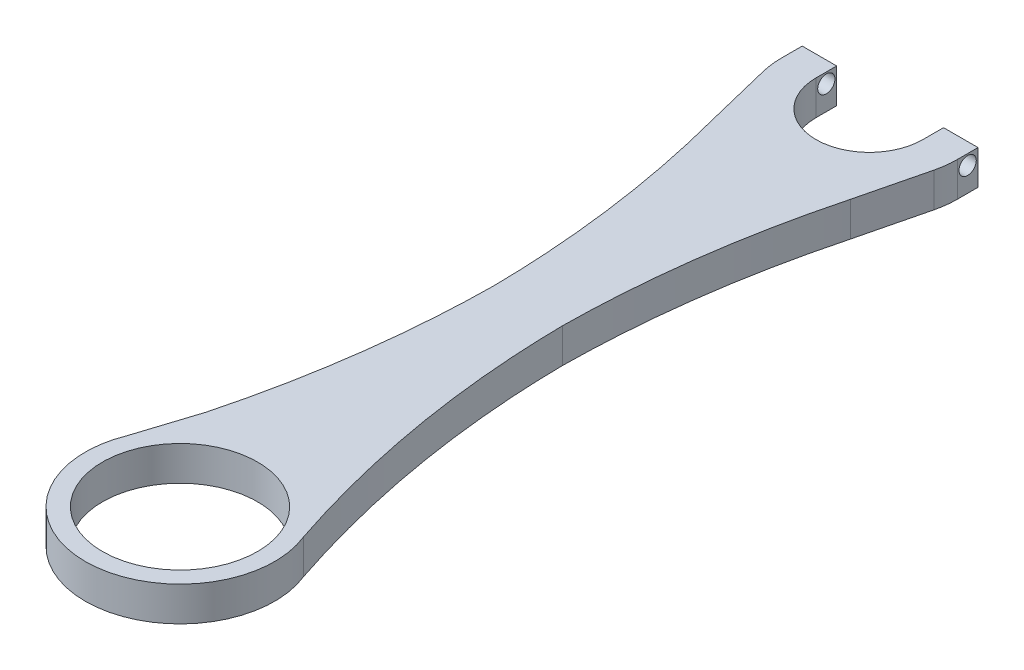
ISO-10303-21;
HEADER;
FILE_DESCRIPTION(('STEP AP214'),'2;1');
FILE_NAME('part.step','',(''),(''),'','','');
FILE_SCHEMA(('AUTOMOTIVE_DESIGN { 1 0 10303 214 1 1 1 1 }'));
ENDSEC;
DATA;
#1=APPLICATION_CONTEXT('core data for automotive mechanical design processes');
#2=APPLICATION_PROTOCOL_DEFINITION('international standard','automotive_design',2000,#1);
#3=PRODUCT_CONTEXT('',#1,'mechanical');
#4=PRODUCT('Part','Part','',(#3));
#5=PRODUCT_RELATED_PRODUCT_CATEGORY('part','',(#4));
#6=PRODUCT_DEFINITION_FORMATION('','',#4);
#7=PRODUCT_DEFINITION_CONTEXT('part definition',#1,'design');
#8=PRODUCT_DEFINITION('design','',#6,#7);
#9=PRODUCT_DEFINITION_SHAPE('','',#8);
#10=(LENGTH_UNIT() NAMED_UNIT(*) SI_UNIT(.MILLI.,.METRE.));
#11=(NAMED_UNIT(*) PLANE_ANGLE_UNIT() SI_UNIT($,.RADIAN.));
#12=(NAMED_UNIT(*) SI_UNIT($,.STERADIAN.) SOLID_ANGLE_UNIT());
#13=UNCERTAINTY_MEASURE_WITH_UNIT(LENGTH_MEASURE(1.E-05),#10,'distance_accuracy_value','');
#14=(GEOMETRIC_REPRESENTATION_CONTEXT(3) GLOBAL_UNCERTAINTY_ASSIGNED_CONTEXT((#13)) GLOBAL_UNIT_ASSIGNED_CONTEXT((#10,
#11,#12)) REPRESENTATION_CONTEXT('',''));
#15=CARTESIAN_POINT('',(0.,0.,0.));
#16=DIRECTION('',(0.,0.,1.));
#17=DIRECTION('',(1.,0.,0.));
#18=AXIS2_PLACEMENT_3D('',#15,#16,#17);
#19=CARTESIAN_POINT('',(24.7655320161866,10.,6.07605332063795));
#20=DIRECTION('',(-0.971197333968103,0.,-0.238276600809331));
#21=DIRECTION('',(-0.238276600809331,0.,0.971197333968103));
#22=AXIS2_PLACEMENT_3D('',#19,#20,#21);
#23=PLANE('',#22);
#24=DIRECTION('',(0.238276600809331,0.,-0.971197333968103));
#25=VECTOR('',#24,1.);
#26=CARTESIAN_POINT('',(24.7655320161866,0.,6.07605332063795));
#27=LINE('',#26,#25);
#28=CARTESIAN_POINT('',(20.,0.,25.5));
#29=VERTEX_POINT('',#28);
#30=CARTESIAN_POINT('',(24.7655320161866,0.,6.07605332063795));
#31=VERTEX_POINT('',#30);
#32=EDGE_CURVE('E311',#29,#31,#27,.T.);
#33=ORIENTED_EDGE('',*,*,#32,.T.);
#34=DIRECTION('',(0.,-1.,0.));
#35=VECTOR('',#34,1.);
#36=CARTESIAN_POINT('',(24.7655320161866,10.,6.07605332063795));
#37=LINE('',#36,#35);
#38=CARTESIAN_POINT('',(24.7655320161866,10.,6.07605332063795));
#39=VERTEX_POINT('',#38);
#40=EDGE_CURVE('E12',#39,#31,#37,.T.);
#41=ORIENTED_EDGE('',*,*,#40,.F.);
#42=DIRECTION('',(0.238276600809331,0.,-0.971197333968103));
#43=VECTOR('',#42,1.);
#44=CARTESIAN_POINT('',(24.7655320161866,10.,6.07605332063795));
#45=LINE('',#44,#43);
#46=CARTESIAN_POINT('',(20.,10.,25.5));
#47=VERTEX_POINT('',#46);
#48=EDGE_CURVE('E354',#47,#39,#45,.T.);
#49=ORIENTED_EDGE('',*,*,#48,.F.);
#50=DIRECTION('',(0.,-1.,0.));
#51=VECTOR('',#50,1.);
#52=CARTESIAN_POINT('',(20.,10.,25.5));
#53=LINE('',#52,#51);
#54=EDGE_CURVE('E132',#47,#29,#53,.T.);
#55=ORIENTED_EDGE('',*,*,#54,.T.);
#56=EDGE_LOOP('',(#33,#41,#49,#55));
#57=FACE_BOUND('',#56,.T.);
#58=ADVANCED_FACE('F116',(#57),#23,.F.);
#59=CARTESIAN_POINT('',(0.,10.,0.));
#60=DIRECTION('',(0.,-1.,0.));
#61=DIRECTION('',(0.,0.,-1.));
#62=AXIS2_PLACEMENT_3D('',#59,#60,#61);
#63=CYLINDRICAL_SURFACE('',#62,25.5);
#64=CARTESIAN_POINT('',(0.,0.,0.));
#65=DIRECTION('',(0.,1.,0.));
#66=DIRECTION('',(0.,0.,1.));
#67=AXIS2_PLACEMENT_3D('',#64,#65,#66);
#68=CIRCLE('',#67,25.5);
#69=CARTESIAN_POINT('',(25.5,0.,0.));
#70=VERTEX_POINT('',#69);
#71=EDGE_CURVE('E314',#31,#70,#68,.T.);
#72=ORIENTED_EDGE('',*,*,#71,.T.);
#73=DIRECTION('',(0.,-1.,0.));
#74=VECTOR('',#73,1.);
#75=CARTESIAN_POINT('',(25.5,10.,0.));
#76=LINE('',#75,#74);
#77=CARTESIAN_POINT('',(25.5,10.,0.));
#78=VERTEX_POINT('',#77);
#79=EDGE_CURVE('E124',#78,#70,#76,.T.);
#80=ORIENTED_EDGE('',*,*,#79,.F.);
#81=CARTESIAN_POINT('',(0.,10.,0.));
#82=DIRECTION('',(0.,1.,0.));
#83=DIRECTION('',(0.,0.,1.));
#84=AXIS2_PLACEMENT_3D('',#81,#82,#83);
#85=CIRCLE('',#84,25.5);
#86=EDGE_CURVE('E189',#39,#78,#85,.T.);
#87=ORIENTED_EDGE('',*,*,#86,.F.);
#88=ORIENTED_EDGE('',*,*,#40,.T.);
#89=EDGE_LOOP('',(#72,#80,#87,#88));
#90=FACE_BOUND('',#89,.T.);
#91=ADVANCED_FACE('F276',(#90),#63,.T.);
#92=CARTESIAN_POINT('',(25.5,10.,0.));
#93=DIRECTION('',(-1.,0.,0.));
#94=DIRECTION('',(0.,0.,1.));
#95=AXIS2_PLACEMENT_3D('',#92,#93,#94);
#96=PLANE('',#95);
#97=CARTESIAN_POINT('',(25.5,7.,-3.));
#98=DIRECTION('',(-1.,0.,0.));
#99=DIRECTION('',(0.,0.,1.));
#100=AXIS2_PLACEMENT_3D('',#97,#98,#99);
#101=CIRCLE('',#100,2.5);
#102=CARTESIAN_POINT('',(25.5,7.,-0.499999999999999));
#103=VERTEX_POINT('',#102);
#104=EDGE_CURVE('E413',#103,#103,#101,.T.);
#105=ORIENTED_EDGE('',*,*,#104,.T.);
#106=EDGE_LOOP('',(#105));
#107=FACE_BOUND('',#106,.T.);
#108=DIRECTION('',(0.,0.,-1.));
#109=VECTOR('',#108,1.);
#110=CARTESIAN_POINT('',(25.5,0.,0.));
#111=LINE('',#110,#109);
#112=CARTESIAN_POINT('',(25.5,0.,-6.));
#113=VERTEX_POINT('',#112);
#114=EDGE_CURVE('E316',#70,#113,#111,.T.);
#115=ORIENTED_EDGE('',*,*,#114,.T.);
#116=DIRECTION('',(0.,-1.,0.));
#117=VECTOR('',#116,1.);
#118=CARTESIAN_POINT('',(25.5,10.,-6.));
#119=LINE('',#118,#117);
#120=CARTESIAN_POINT('',(25.5,10.,-6.));
#121=VERTEX_POINT('',#120);
#122=EDGE_CURVE('E373',#121,#113,#119,.T.);
#123=ORIENTED_EDGE('',*,*,#122,.F.);
#124=DIRECTION('',(0.,0.,-1.));
#125=VECTOR('',#124,1.);
#126=CARTESIAN_POINT('',(25.5,10.,0.));
#127=LINE('',#126,#125);
#128=EDGE_CURVE('E378',#78,#121,#127,.T.);
#129=ORIENTED_EDGE('',*,*,#128,.F.);
#130=ORIENTED_EDGE('',*,*,#79,.T.);
#131=EDGE_LOOP('',(#115,#123,#129,#130));
#132=FACE_BOUND('',#131,.T.);
#133=ADVANCED_FACE('F298',(#107,#132),#96,.F.);
#134=CARTESIAN_POINT('',(0.,10.,-6.));
#135=DIRECTION('',(0.,0.,-1.));
#136=DIRECTION('',(-1.,0.,0.));
#137=AXIS2_PLACEMENT_3D('',#134,#135,#136);
#138=PLANE('',#137);
#139=DIRECTION('',(1.,0.,0.));
#140=VECTOR('',#139,1.);
#141=CARTESIAN_POINT('',(0.,0.,-6.));
#142=LINE('',#141,#140);
#143=CARTESIAN_POINT('',(15.5,0.,-6.));
#144=VERTEX_POINT('',#143);
#145=EDGE_CURVE('E324',#144,#113,#142,.T.);
#146=ORIENTED_EDGE('',*,*,#145,.F.);
#147=DIRECTION('',(0.,-1.,0.));
#148=VECTOR('',#147,1.);
#149=CARTESIAN_POINT('',(15.5,10.,-6.));
#150=LINE('',#149,#148);
#151=CARTESIAN_POINT('',(15.5,10.,-6.));
#152=VERTEX_POINT('',#151);
#153=EDGE_CURVE('E371',#152,#144,#150,.T.);
#154=ORIENTED_EDGE('',*,*,#153,.F.);
#155=DIRECTION('',(1.,0.,0.));
#156=VECTOR('',#155,1.);
#157=CARTESIAN_POINT('',(0.,10.,-6.));
#158=LINE('',#157,#156);
#159=EDGE_CURVE('E386',#152,#121,#158,.T.);
#160=ORIENTED_EDGE('',*,*,#159,.T.);
#161=ORIENTED_EDGE('',*,*,#122,.T.);
#162=EDGE_LOOP('',(#146,#154,#160,#161));
#163=FACE_BOUND('',#162,.T.);
#164=ADVANCED_FACE('F295',(#163),#138,.T.);
#165=CARTESIAN_POINT('',(15.5,10.,0.));
#166=DIRECTION('',(-1.,0.,0.));
#167=DIRECTION('',(0.,0.,1.));
#168=AXIS2_PLACEMENT_3D('',#165,#166,#167);
#169=PLANE('',#168);
#170=CARTESIAN_POINT('',(15.5,7.,-3.));
#171=DIRECTION('',(-1.,0.,0.));
#172=DIRECTION('',(0.,0.,1.));
#173=AXIS2_PLACEMENT_3D('',#170,#171,#172);
#174=CIRCLE('',#173,2.5);
#175=CARTESIAN_POINT('',(15.5,7.,-0.499999999999999));
#176=VERTEX_POINT('',#175);
#177=EDGE_CURVE('E417',#176,#176,#174,.T.);
#178=ORIENTED_EDGE('',*,*,#177,.F.);
#179=EDGE_LOOP('',(#178));
#180=FACE_BOUND('',#179,.T.);
#181=DIRECTION('',(0.,0.,-1.));
#182=VECTOR('',#181,1.);
#183=CARTESIAN_POINT('',(15.5,0.,0.));
#184=LINE('',#183,#182);
#185=CARTESIAN_POINT('',(15.5,0.,0.));
#186=VERTEX_POINT('',#185);
#187=EDGE_CURVE('E327',#186,#144,#184,.T.);
#188=ORIENTED_EDGE('',*,*,#187,.F.);
#189=DIRECTION('',(0.,-1.,0.));
#190=VECTOR('',#189,1.);
#191=CARTESIAN_POINT('',(15.5,10.,0.));
#192=LINE('',#191,#190);
#193=CARTESIAN_POINT('',(15.5,10.,0.));
#194=VERTEX_POINT('',#193);
#195=EDGE_CURVE('E369',#194,#186,#192,.T.);
#196=ORIENTED_EDGE('',*,*,#195,.F.);
#197=DIRECTION('',(0.,0.,-1.));
#198=VECTOR('',#197,1.);
#199=CARTESIAN_POINT('',(15.5,10.,0.));
#200=LINE('',#199,#198);
#201=EDGE_CURVE('E389',#194,#152,#200,.T.);
#202=ORIENTED_EDGE('',*,*,#201,.T.);
#203=ORIENTED_EDGE('',*,*,#153,.T.);
#204=EDGE_LOOP('',(#188,#196,#202,#203));
#205=FACE_BOUND('',#204,.T.);
#206=ADVANCED_FACE('F291',(#180,#205),#169,.T.);
#207=CARTESIAN_POINT('',(0.,10.,0.));
#208=DIRECTION('',(0.,-1.,0.));
#209=DIRECTION('',(0.,0.,-1.));
#210=AXIS2_PLACEMENT_3D('',#207,#208,#209);
#211=CYLINDRICAL_SURFACE('',#210,15.5);
#212=CARTESIAN_POINT('',(0.,0.,0.));
#213=DIRECTION('',(0.,1.,0.));
#214=DIRECTION('',(0.,0.,1.));
#215=AXIS2_PLACEMENT_3D('',#212,#213,#214);
#216=CIRCLE('',#215,15.5);
#217=CARTESIAN_POINT('',(-15.5,0.,0.));
#218=VERTEX_POINT('',#217);
#219=EDGE_CURVE('E330',#218,#186,#216,.T.);
#220=ORIENTED_EDGE('',*,*,#219,.F.);
#221=DIRECTION('',(0.,-1.,0.));
#222=VECTOR('',#221,1.);
#223=CARTESIAN_POINT('',(-15.5,10.,0.));
#224=LINE('',#223,#222);
#225=CARTESIAN_POINT('',(-15.5,10.,0.));
#226=VERTEX_POINT('',#225);
#227=EDGE_CURVE('E367',#226,#218,#224,.T.);
#228=ORIENTED_EDGE('',*,*,#227,.F.);
#229=CARTESIAN_POINT('',(0.,10.,0.));
#230=DIRECTION('',(0.,1.,0.));
#231=DIRECTION('',(0.,0.,1.));
#232=AXIS2_PLACEMENT_3D('',#229,#230,#231);
#233=CIRCLE('',#232,15.5);
#234=EDGE_CURVE('E391',#226,#194,#233,.T.);
#235=ORIENTED_EDGE('',*,*,#234,.T.);
#236=ORIENTED_EDGE('',*,*,#195,.T.);
#237=EDGE_LOOP('',(#220,#228,#235,#236));
#238=FACE_BOUND('',#237,.T.);
#239=ADVANCED_FACE('F287',(#238),#211,.F.);
#240=CARTESIAN_POINT('',(-15.5,10.,0.));
#241=DIRECTION('',(-1.,0.,0.));
#242=DIRECTION('',(0.,0.,1.));
#243=AXIS2_PLACEMENT_3D('',#240,#241,#242);
#244=PLANE('',#243);
#245=CARTESIAN_POINT('',(-15.5,7.,-3.));
#246=DIRECTION('',(-1.,0.,0.));
#247=DIRECTION('',(0.,0.,1.));
#248=AXIS2_PLACEMENT_3D('',#245,#246,#247);
#249=CIRCLE('',#248,2.5);
#250=CARTESIAN_POINT('',(-15.5,7.,-0.499999999999999));
#251=VERTEX_POINT('',#250);
#252=EDGE_CURVE('E738',#251,#251,#249,.T.);
#253=ORIENTED_EDGE('',*,*,#252,.T.);
#254=EDGE_LOOP('',(#253));
#255=FACE_BOUND('',#254,.T.);
#256=DIRECTION('',(0.,0.,-1.));
#257=VECTOR('',#256,1.);
#258=CARTESIAN_POINT('',(-15.5,0.,0.));
#259=LINE('',#258,#257);
#260=CARTESIAN_POINT('',(-15.5,0.,-6.));
#261=VERTEX_POINT('',#260);
#262=EDGE_CURVE('E333',#218,#261,#259,.T.);
#263=ORIENTED_EDGE('',*,*,#262,.T.);
#264=DIRECTION('',(0.,-1.,0.));
#265=VECTOR('',#264,1.);
#266=CARTESIAN_POINT('',(-15.5,10.,-6.));
#267=LINE('',#266,#265);
#268=CARTESIAN_POINT('',(-15.5,10.,-6.));
#269=VERTEX_POINT('',#268);
#270=EDGE_CURVE('E365',#269,#261,#267,.T.);
#271=ORIENTED_EDGE('',*,*,#270,.F.);
#272=DIRECTION('',(0.,0.,-1.));
#273=VECTOR('',#272,1.);
#274=CARTESIAN_POINT('',(-15.5,10.,0.));
#275=LINE('',#274,#273);
#276=EDGE_CURVE('E397',#226,#269,#275,.T.);
#277=ORIENTED_EDGE('',*,*,#276,.F.);
#278=ORIENTED_EDGE('',*,*,#227,.T.);
#279=EDGE_LOOP('',(#263,#271,#277,#278));
#280=FACE_BOUND('',#279,.T.);
#281=ADVANCED_FACE('F283',(#255,#280),#244,.F.);
#282=CARTESIAN_POINT('',(0.,10.,-6.));
#283=DIRECTION('',(0.,0.,-1.));
#284=DIRECTION('',(-1.,0.,0.));
#285=AXIS2_PLACEMENT_3D('',#282,#283,#284);
#286=PLANE('',#285);
#287=DIRECTION('',(1.,0.,0.));
#288=VECTOR('',#287,1.);
#289=CARTESIAN_POINT('',(0.,0.,-6.));
#290=LINE('',#289,#288);
#291=CARTESIAN_POINT('',(-25.5,0.,-6.));
#292=VERTEX_POINT('',#291);
#293=EDGE_CURVE('E336',#292,#261,#290,.T.);
#294=ORIENTED_EDGE('',*,*,#293,.F.);
#295=DIRECTION('',(0.,-1.,0.));
#296=VECTOR('',#295,1.);
#297=CARTESIAN_POINT('',(-25.5,10.,-6.));
#298=LINE('',#297,#296);
#299=CARTESIAN_POINT('',(-25.5,10.,-6.));
#300=VERTEX_POINT('',#299);
#301=EDGE_CURVE('E363',#300,#292,#298,.T.);
#302=ORIENTED_EDGE('',*,*,#301,.F.);
#303=DIRECTION('',(1.,0.,0.));
#304=VECTOR('',#303,1.);
#305=CARTESIAN_POINT('',(0.,10.,-6.));
#306=LINE('',#305,#304);
#307=EDGE_CURVE('E398',#300,#269,#306,.T.);
#308=ORIENTED_EDGE('',*,*,#307,.T.);
#309=ORIENTED_EDGE('',*,*,#270,.T.);
#310=EDGE_LOOP('',(#294,#302,#308,#309));
#311=FACE_BOUND('',#310,.T.);
#312=ADVANCED_FACE('F279',(#311),#286,.T.);
#313=CARTESIAN_POINT('',(-25.5,10.,0.));
#314=DIRECTION('',(-1.,0.,0.));
#315=DIRECTION('',(0.,0.,1.));
#316=AXIS2_PLACEMENT_3D('',#313,#314,#315);
#317=PLANE('',#316);
#318=CARTESIAN_POINT('',(-25.5,7.,-3.));
#319=DIRECTION('',(-1.,0.,0.));
#320=DIRECTION('',(0.,0.,1.));
#321=AXIS2_PLACEMENT_3D('',#318,#319,#320);
#322=CIRCLE('',#321,2.5);
#323=CARTESIAN_POINT('',(-25.5,7.,-0.499999999999999));
#324=VERTEX_POINT('',#323);
#325=EDGE_CURVE('E741',#324,#324,#322,.T.);
#326=ORIENTED_EDGE('',*,*,#325,.F.);
#327=EDGE_LOOP('',(#326));
#328=FACE_BOUND('',#327,.T.);
#329=DIRECTION('',(0.,0.,-1.));
#330=VECTOR('',#329,1.);
#331=CARTESIAN_POINT('',(-25.5,0.,0.));
#332=LINE('',#331,#330);
#333=CARTESIAN_POINT('',(-25.5,0.,0.));
#334=VERTEX_POINT('',#333);
#335=EDGE_CURVE('E339',#334,#292,#332,.T.);
#336=ORIENTED_EDGE('',*,*,#335,.F.);
#337=DIRECTION('',(0.,-1.,0.));
#338=VECTOR('',#337,1.);
#339=CARTESIAN_POINT('',(-25.5,10.,0.));
#340=LINE('',#339,#338);
#341=CARTESIAN_POINT('',(-25.5,10.,0.));
#342=VERTEX_POINT('',#341);
#343=EDGE_CURVE('E242',#342,#334,#340,.T.);
#344=ORIENTED_EDGE('',*,*,#343,.F.);
#345=DIRECTION('',(0.,0.,-1.));
#346=VECTOR('',#345,1.);
#347=CARTESIAN_POINT('',(-25.5,10.,0.));
#348=LINE('',#347,#346);
#349=EDGE_CURVE('E231',#342,#300,#348,.T.);
#350=ORIENTED_EDGE('',*,*,#349,.T.);
#351=ORIENTED_EDGE('',*,*,#301,.T.);
#352=EDGE_LOOP('',(#336,#344,#350,#351));
#353=FACE_BOUND('',#352,.T.);
#354=ADVANCED_FACE('F275',(#328,#353),#317,.T.);
#355=CARTESIAN_POINT('',(-24.7655320161866,0.,6.07605332063793));
#356=VERTEX_POINT('',#355);
#357=EDGE_CURVE('E238',#334,#356,#68,.T.);
#358=ORIENTED_EDGE('',*,*,#357,.T.);
#359=DIRECTION('',(0.,-1.,0.));
#360=VECTOR('',#359,1.);
#361=CARTESIAN_POINT('',(-24.7655320161866,10.,6.07605332063793));
#362=LINE('',#361,#360);
#363=CARTESIAN_POINT('',(-24.7655320161866,10.,6.07605332063793));
#364=VERTEX_POINT('',#363);
#365=EDGE_CURVE('E235',#364,#356,#362,.T.);
#366=ORIENTED_EDGE('',*,*,#365,.F.);
#367=EDGE_CURVE('E221',#342,#364,#85,.T.);
#368=ORIENTED_EDGE('',*,*,#367,.F.);
#369=ORIENTED_EDGE('',*,*,#343,.T.);
#370=EDGE_LOOP('',(#358,#366,#368,#369));
#371=FACE_BOUND('',#370,.T.);
#372=ADVANCED_FACE('F236',(#371),#63,.T.);
#373=CARTESIAN_POINT('',(-24.7655320161866,10.,6.07605332063794));
#374=DIRECTION('',(-0.971197333968103,0.,0.238276600809331));
#375=DIRECTION('',(0.238276600809331,0.,0.971197333968103));
#376=AXIS2_PLACEMENT_3D('',#373,#374,#375);
#377=PLANE('',#376);
#378=DIRECTION('',(-0.238276600809331,0.,-0.971197333968103));
#379=VECTOR('',#378,1.);
#380=CARTESIAN_POINT('',(-24.7655320161866,0.,6.07605332063794));
#381=LINE('',#380,#379);
#382=CARTESIAN_POINT('',(-20.,0.,25.4999999999999));
#383=VERTEX_POINT('',#382);
#384=EDGE_CURVE('E342',#383,#356,#381,.T.);
#385=ORIENTED_EDGE('',*,*,#384,.F.);
#386=DIRECTION('',(0.,-1.,0.));
#387=VECTOR('',#386,1.);
#388=CARTESIAN_POINT('',(-20.,10.,25.4999999999999));
#389=LINE('',#388,#387);
#390=CARTESIAN_POINT('',(-20.,10.,25.4999999999999));
#391=VERTEX_POINT('',#390);
#392=EDGE_CURVE('E243',#391,#383,#389,.T.);
#393=ORIENTED_EDGE('',*,*,#392,.F.);
#394=DIRECTION('',(-0.238276600809331,0.,-0.971197333968103));
#395=VECTOR('',#394,1.);
#396=CARTESIAN_POINT('',(-24.7655320161866,10.,6.07605332063794));
#397=LINE('',#396,#395);
#398=EDGE_CURVE('E228',#391,#364,#397,.T.);
#399=ORIENTED_EDGE('',*,*,#398,.T.);
#400=ORIENTED_EDGE('',*,*,#365,.T.);
#401=EDGE_LOOP('',(#385,#393,#399,#400));
#402=FACE_BOUND('',#401,.T.);
#403=ADVANCED_FACE('F245',(#402),#377,.T.);
#404=CARTESIAN_POINT('',(-20.,10.,25.5));
#405=CARTESIAN_POINT('',(-9.54379787803549,10.,65.2645091880622));
#406=CARTESIAN_POINT('',(-10.,10.,105.767954903258));
#407=B_SPLINE_CURVE_WITH_KNOTS('',2,(#404,#405,#406),.UNSPECIFIED.,.F.,.F.,(3,3),(0.,1.),.UNSPECIFIED.);
#408=DIRECTION('',(0.,-1.,0.));
#409=VECTOR('',#408,1.);
#410=SURFACE_OF_LINEAR_EXTRUSION('',#407,#409);
#411=CARTESIAN_POINT('',(-20.,0.,25.5));
#412=CARTESIAN_POINT('',(-9.54379787803549,0.,65.2645091880622));
#413=CARTESIAN_POINT('',(-10.,0.,105.767954903258));
#414=B_SPLINE_CURVE_WITH_KNOTS('',2,(#411,#412,#413),.UNSPECIFIED.,.F.,.F.,(3,3),(0.,1.),.UNSPECIFIED.);
#415=CARTESIAN_POINT('',(-10.,0.,99.));
#416=VERTEX_POINT('',#415);
#417=EDGE_CURVE('E177',#383,#416,#414,.T.);
#418=ORIENTED_EDGE('',*,*,#417,.T.);
#419=DIRECTION('',(0.,-1.,0.));
#420=VECTOR('',#419,1.);
#421=CARTESIAN_POINT('',(-10.,10.,99.));
#422=LINE('',#421,#420);
#423=CARTESIAN_POINT('',(-10.,10.,99.));
#424=VERTEX_POINT('',#423);
#425=EDGE_CURVE('E359',#424,#416,#422,.T.);
#426=ORIENTED_EDGE('',*,*,#425,.F.);
#427=EDGE_CURVE('E247',#391,#424,#407,.T.);
#428=ORIENTED_EDGE('',*,*,#427,.F.);
#429=ORIENTED_EDGE('',*,*,#392,.T.);
#430=EDGE_LOOP('',(#418,#426,#428,#429));
#431=FACE_BOUND('',#430,.T.);
#432=ADVANCED_FACE('F265',(#431),#410,.F.);
#433=CARTESIAN_POINT('',(20.,10.,25.5));
#434=CARTESIAN_POINT('',(9.54379787803548,10.,65.2645091880622));
#435=CARTESIAN_POINT('',(9.99999999999999,10.,105.767954903258));
#436=B_SPLINE_CURVE_WITH_KNOTS('',2,(#433,#434,#435),.UNSPECIFIED.,.F.,.F.,(3,3),(0.,1.),.UNSPECIFIED.);
#437=DIRECTION('',(0.,-1.,0.));
#438=VECTOR('',#437,1.);
#439=SURFACE_OF_LINEAR_EXTRUSION('',#436,#438);
#440=DIRECTION('',(0.,1.,0.));
#441=VECTOR('',#440,1.);
#442=CARTESIAN_POINT('',(9.99999999999999,0.,99.));
#443=LINE('',#442,#441);
#444=CARTESIAN_POINT('',(9.99999999999999,0.,99.));
#445=VERTEX_POINT('',#444);
#446=CARTESIAN_POINT('',(9.99999999999999,10.,99.));
#447=VERTEX_POINT('',#446);
#448=EDGE_CURVE('E315',#445,#447,#443,.T.);
#449=ORIENTED_EDGE('',*,*,#448,.F.);
#450=CARTESIAN_POINT('',(20.,0.,25.5));
#451=CARTESIAN_POINT('',(9.54379787803548,0.,65.2645091880622));
#452=CARTESIAN_POINT('',(9.99999999999999,0.,105.767954903258));
#453=B_SPLINE_CURVE_WITH_KNOTS('',2,(#450,#451,#452),.UNSPECIFIED.,.F.,.F.,(3,3),(0.,1.),.UNSPECIFIED.);
#454=EDGE_CURVE('E347',#29,#445,#453,.T.);
#455=ORIENTED_EDGE('',*,*,#454,.F.);
#456=ORIENTED_EDGE('',*,*,#54,.F.);
#457=EDGE_CURVE('E249',#47,#447,#436,.T.);
#458=ORIENTED_EDGE('',*,*,#457,.T.);
#459=EDGE_LOOP('',(#449,#455,#456,#458));
#460=FACE_BOUND('',#459,.T.);
#461=ADVANCED_FACE('F269',(#460),#439,.T.);
#462=CARTESIAN_POINT('',(0.,10.,0.));
#463=DIRECTION('',(0.,1.,0.));
#464=DIRECTION('',(0.,0.,1.));
#465=AXIS2_PLACEMENT_3D('',#462,#463,#464);
#466=PLANE('',#465);
#467=CARTESIAN_POINT('',(0.,10.,200.));
#468=DIRECTION('',(0.,1.,0.));
#469=DIRECTION('',(0.,0.,1.));
#470=AXIS2_PLACEMENT_3D('',#467,#468,#469);
#471=CIRCLE('',#470,27.5);
#472=CARTESIAN_POINT('',(-25.5,10.,189.704369859013));
#473=VERTEX_POINT('',#472);
#474=CARTESIAN_POINT('',(25.5,10.,189.704369859013));
#475=VERTEX_POINT('',#474);
#476=EDGE_CURVE('E710',#473,#475,#471,.T.);
#477=ORIENTED_EDGE('',*,*,#476,.T.);
#478=CARTESIAN_POINT('',(25.5,10.,189.704369859013));
#479=CARTESIAN_POINT('',(9.42999230686588,10.,141.673973685796));
#480=CARTESIAN_POINT('',(9.99999999999999,10.,92.2320450967424));
#481=B_SPLINE_CURVE_WITH_KNOTS('',2,(#478,#479,#480),.UNSPECIFIED.,.F.,.F.,(3,3),(0.,1.),.UNSPECIFIED.);
#482=EDGE_CURVE('E440',#475,#447,#481,.T.);
#483=ORIENTED_EDGE('',*,*,#482,.T.);
#484=ORIENTED_EDGE('',*,*,#457,.F.);
#485=ORIENTED_EDGE('',*,*,#48,.T.);
#486=ORIENTED_EDGE('',*,*,#86,.T.);
#487=ORIENTED_EDGE('',*,*,#128,.T.);
#488=ORIENTED_EDGE('',*,*,#159,.F.);
#489=ORIENTED_EDGE('',*,*,#201,.F.);
#490=ORIENTED_EDGE('',*,*,#234,.F.);
#491=ORIENTED_EDGE('',*,*,#276,.T.);
#492=ORIENTED_EDGE('',*,*,#307,.F.);
#493=ORIENTED_EDGE('',*,*,#349,.F.);
#494=ORIENTED_EDGE('',*,*,#367,.T.);
#495=ORIENTED_EDGE('',*,*,#398,.F.);
#496=ORIENTED_EDGE('',*,*,#427,.T.);
#497=CARTESIAN_POINT('',(-20.,10.,172.5));
#498=CARTESIAN_POINT('',(-9.54379787803548,10.,132.735490811938));
#499=CARTESIAN_POINT('',(-10.,10.,92.2320450967424));
#500=B_SPLINE_CURVE_WITH_KNOTS('',2,(#497,#498,#499),.UNSPECIFIED.,.F.,.F.,(3,3),(0.,1.),.UNSPECIFIED.);
#501=CARTESIAN_POINT('',(-20.,10.,172.5));
#502=VERTEX_POINT('',#501);
#503=EDGE_CURVE('E433',#502,#424,#500,.T.);
#504=ORIENTED_EDGE('',*,*,#503,.F.);
#505=DIRECTION('',(-0.304504599850484,0.,0.952510865381543));
#506=VECTOR('',#505,1.);
#507=CARTESIAN_POINT('',(31.8870406621544,10.,10.193847556118));
#508=LINE('',#507,#506);
#509=EDGE_CURVE('E715',#502,#473,#508,.T.);
#510=ORIENTED_EDGE('',*,*,#509,.T.);
#511=EDGE_LOOP('',(#477,#483,#484,#485,#486,#487,#488,#489,#490,#491,#492,#493,#494,#495,#496,
#504,#510));
#512=FACE_BOUND('',#511,.T.);
#513=CARTESIAN_POINT('',(0.,10.,200.));
#514=DIRECTION('',(0.,1.,0.));
#515=DIRECTION('',(0.,0.,1.));
#516=AXIS2_PLACEMENT_3D('',#513,#514,#515);
#517=CIRCLE('',#516,22.5);
#518=CARTESIAN_POINT('',(0.,10.,222.5));
#519=VERTEX_POINT('',#518);
#520=EDGE_CURVE('E422',#519,#519,#517,.T.);
#521=ORIENTED_EDGE('',*,*,#520,.F.);
#522=EDGE_LOOP('',(#521));
#523=FACE_BOUND('',#522,.T.);
#524=ADVANCED_FACE('F224',(#512,#523),#466,.T.);
#525=CARTESIAN_POINT('',(0.,0.,0.));
#526=DIRECTION('',(0.,1.,0.));
#527=DIRECTION('',(0.,0.,1.));
#528=AXIS2_PLACEMENT_3D('',#525,#526,#527);
#529=PLANE('',#528);
#530=CARTESIAN_POINT('',(25.5,0.,189.704369859013));
#531=CARTESIAN_POINT('',(9.42999230686588,0.,141.673973685796));
#532=CARTESIAN_POINT('',(9.99999999999999,0.,92.2320450967424));
#533=B_SPLINE_CURVE_WITH_KNOTS('',2,(#530,#531,#532),.UNSPECIFIED.,.F.,.F.,(3,3),(0.,1.),.UNSPECIFIED.);
#534=CARTESIAN_POINT('',(25.5,0.,189.704369859013));
#535=VERTEX_POINT('',#534);
#536=EDGE_CURVE('E441',#535,#445,#533,.T.);
#537=ORIENTED_EDGE('',*,*,#536,.F.);
#538=CARTESIAN_POINT('',(0.,0.,200.));
#539=DIRECTION('',(0.,1.,0.));
#540=DIRECTION('',(0.,0.,1.));
#541=AXIS2_PLACEMENT_3D('',#538,#539,#540);
#542=CIRCLE('',#541,27.5);
#543=CARTESIAN_POINT('',(-25.5,0.,189.704369859013));
#544=VERTEX_POINT('',#543);
#545=EDGE_CURVE('E415',#544,#535,#542,.T.);
#546=ORIENTED_EDGE('',*,*,#545,.F.);
#547=DIRECTION('',(-0.304504599850484,0.,0.952510865381543));
#548=VECTOR('',#547,1.);
#549=CARTESIAN_POINT('',(31.8870406621544,0.,10.193847556118));
#550=LINE('',#549,#548);
#551=CARTESIAN_POINT('',(-20.,0.,172.5));
#552=VERTEX_POINT('',#551);
#553=EDGE_CURVE('E410',#552,#544,#550,.T.);
#554=ORIENTED_EDGE('',*,*,#553,.F.);
#555=CARTESIAN_POINT('',(-20.,0.,172.5));
#556=CARTESIAN_POINT('',(-9.54379787803548,0.,132.735490811938));
#557=CARTESIAN_POINT('',(-10.,0.,92.2320450967424));
#558=B_SPLINE_CURVE_WITH_KNOTS('',2,(#555,#556,#557),.UNSPECIFIED.,.F.,.F.,(3,3),(0.,1.),.UNSPECIFIED.);
#559=EDGE_CURVE('E406',#552,#416,#558,.T.);
#560=ORIENTED_EDGE('',*,*,#559,.T.);
#561=ORIENTED_EDGE('',*,*,#417,.F.);
#562=ORIENTED_EDGE('',*,*,#384,.T.);
#563=ORIENTED_EDGE('',*,*,#357,.F.);
#564=ORIENTED_EDGE('',*,*,#335,.T.);
#565=ORIENTED_EDGE('',*,*,#293,.T.);
#566=ORIENTED_EDGE('',*,*,#262,.F.);
#567=ORIENTED_EDGE('',*,*,#219,.T.);
#568=ORIENTED_EDGE('',*,*,#187,.T.);
#569=ORIENTED_EDGE('',*,*,#145,.T.);
#570=ORIENTED_EDGE('',*,*,#114,.F.);
#571=ORIENTED_EDGE('',*,*,#71,.F.);
#572=ORIENTED_EDGE('',*,*,#32,.F.);
#573=ORIENTED_EDGE('',*,*,#454,.T.);
#574=EDGE_LOOP('',(#537,#546,#554,#560,#561,#562,#563,#564,#565,#566,#567,#568,#569,#570,#571,
#572,#573));
#575=FACE_BOUND('',#574,.T.);
#576=CARTESIAN_POINT('',(0.,0.,200.));
#577=DIRECTION('',(0.,1.,0.));
#578=DIRECTION('',(0.,0.,1.));
#579=AXIS2_PLACEMENT_3D('',#576,#577,#578);
#580=CIRCLE('',#579,22.5);
#581=CARTESIAN_POINT('',(0.,0.,222.5));
#582=VERTEX_POINT('',#581);
#583=EDGE_CURVE('E430',#582,#582,#580,.T.);
#584=ORIENTED_EDGE('',*,*,#583,.T.);
#585=EDGE_LOOP('',(#584));
#586=FACE_BOUND('',#585,.T.);
#587=ADVANCED_FACE('F380',(#575,#586),#529,.F.);
#588=DIRECTION('',(0.,1.,0.));
#589=VECTOR('',#588,1.);
#590=SURFACE_OF_LINEAR_EXTRUSION('',#533,#589);
#591=ORIENTED_EDGE('',*,*,#482,.F.);
#592=DIRECTION('',(0.,1.,0.));
#593=VECTOR('',#592,1.);
#594=CARTESIAN_POINT('',(25.5,0.,189.704369859013));
#595=LINE('',#594,#593);
#596=EDGE_CURVE('E319',#535,#475,#595,.T.);
#597=ORIENTED_EDGE('',*,*,#596,.F.);
#598=ORIENTED_EDGE('',*,*,#536,.T.);
#599=ORIENTED_EDGE('',*,*,#448,.T.);
#600=EDGE_LOOP('',(#591,#597,#598,#599));
#601=FACE_BOUND('',#600,.T.);
#602=ADVANCED_FACE('F453',(#601),#590,.T.);
#603=DIRECTION('',(0.,-1.,0.));
#604=VECTOR('',#603,1.);
#605=SURFACE_OF_LINEAR_EXTRUSION('',#500,#604);
#606=ORIENTED_EDGE('',*,*,#559,.F.);
#607=DIRECTION('',(0.,-1.,0.));
#608=VECTOR('',#607,1.);
#609=CARTESIAN_POINT('',(-20.,10.,172.5));
#610=LINE('',#609,#608);
#611=EDGE_CURVE('E437',#502,#552,#610,.T.);
#612=ORIENTED_EDGE('',*,*,#611,.F.);
#613=ORIENTED_EDGE('',*,*,#503,.T.);
#614=ORIENTED_EDGE('',*,*,#425,.T.);
#615=EDGE_LOOP('',(#606,#612,#613,#614));
#616=FACE_BOUND('',#615,.T.);
#617=ADVANCED_FACE('F457',(#616),#605,.T.);
#618=CARTESIAN_POINT('',(31.8870406621544,10.,10.193847556118));
#619=DIRECTION('',(0.952510865381543,0.,0.304504599850484));
#620=DIRECTION('',(0.304504599850484,0.,-0.952510865381543));
#621=AXIS2_PLACEMENT_3D('',#618,#619,#620);
#622=PLANE('',#621);
#623=ORIENTED_EDGE('',*,*,#553,.T.);
#624=DIRECTION('',(0.,-1.,0.));
#625=VECTOR('',#624,1.);
#626=CARTESIAN_POINT('',(-25.5,10.,189.704369859013));
#627=LINE('',#626,#625);
#628=EDGE_CURVE('E434',#473,#544,#627,.T.);
#629=ORIENTED_EDGE('',*,*,#628,.F.);
#630=ORIENTED_EDGE('',*,*,#509,.F.);
#631=ORIENTED_EDGE('',*,*,#611,.T.);
#632=EDGE_LOOP('',(#623,#629,#630,#631));
#633=FACE_BOUND('',#632,.T.);
#634=ADVANCED_FACE('F478',(#633),#622,.F.);
#635=CARTESIAN_POINT('',(0.,10.,200.));
#636=DIRECTION('',(0.,-1.,0.));
#637=DIRECTION('',(0.,0.,-1.));
#638=AXIS2_PLACEMENT_3D('',#635,#636,#637);
#639=CYLINDRICAL_SURFACE('',#638,27.5);
#640=ORIENTED_EDGE('',*,*,#596,.T.);
#641=ORIENTED_EDGE('',*,*,#476,.F.);
#642=ORIENTED_EDGE('',*,*,#628,.T.);
#643=ORIENTED_EDGE('',*,*,#545,.T.);
#644=EDGE_LOOP('',(#640,#641,#642,#643));
#645=FACE_BOUND('',#644,.T.);
#646=ADVANCED_FACE('F484',(#645),#639,.T.);
#647=CARTESIAN_POINT('',(0.,10.,200.));
#648=DIRECTION('',(0.,-1.,0.));
#649=DIRECTION('',(0.,0.,-1.));
#650=AXIS2_PLACEMENT_3D('',#647,#648,#649);
#651=CYLINDRICAL_SURFACE('',#650,22.5);
#652=ORIENTED_EDGE('',*,*,#520,.T.);
#653=EDGE_LOOP('',(#652));
#654=FACE_BOUND('',#653,.T.);
#655=ORIENTED_EDGE('',*,*,#583,.F.);
#656=EDGE_LOOP('',(#655));
#657=FACE_BOUND('',#656,.T.);
#658=ADVANCED_FACE('F491',(#654,#657),#651,.F.);
#659=CARTESIAN_POINT('',(27.5,7.,-3.));
#660=DIRECTION('',(-1.,0.,0.));
#661=DIRECTION('',(0.,0.,1.));
#662=AXIS2_PLACEMENT_3D('',#659,#660,#661);
#663=CYLINDRICAL_SURFACE('',#662,2.5);
#664=ORIENTED_EDGE('',*,*,#325,.T.);
#665=EDGE_LOOP('',(#664));
#666=FACE_BOUND('',#665,.T.);
#667=ORIENTED_EDGE('',*,*,#252,.F.);
#668=EDGE_LOOP('',(#667));
#669=FACE_BOUND('',#668,.T.);
#670=ADVANCED_FACE('F499',(#666,#669),#663,.F.);
#671=ORIENTED_EDGE('',*,*,#177,.T.);
#672=EDGE_LOOP('',(#671));
#673=FACE_BOUND('',#672,.T.);
#674=ORIENTED_EDGE('',*,*,#104,.F.);
#675=EDGE_LOOP('',(#674));
#676=FACE_BOUND('',#675,.T.);
#677=ADVANCED_FACE('F507',(#673,#676),#663,.F.);
#678=CLOSED_SHELL('',(#58,#91,#133,#164,#206,#239,#281,#312,#354,#372,#403,#432,#461,#524,#587,
#602,#617,#634,#646,#658,#670,#677));
#679=MANIFOLD_SOLID_BREP('B2',#678);
#680=ADVANCED_BREP_SHAPE_REPRESENTATION('',(#18,#679),#14);
#681=SHAPE_DEFINITION_REPRESENTATION(#9,#680);
ENDSEC;
END-ISO-10303-21;
